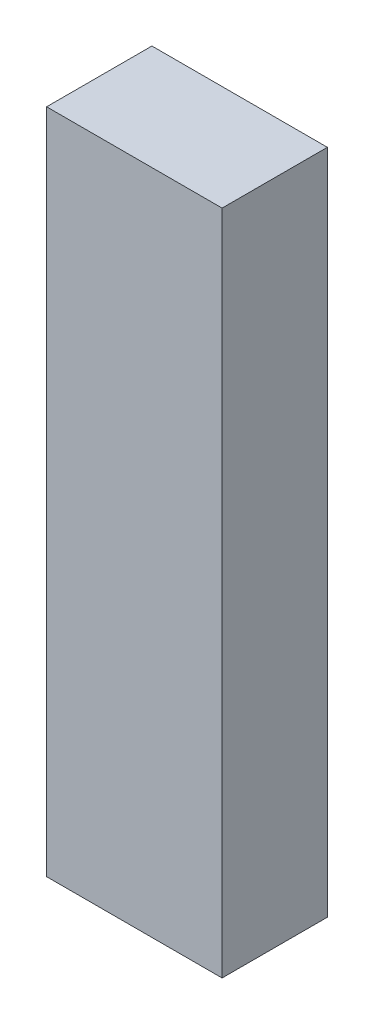
ISO-10303-21;
HEADER;
FILE_DESCRIPTION(('STEP AP214'),'2;1');
FILE_NAME('part.step','',(''),(''),'','','');
FILE_SCHEMA(('AUTOMOTIVE_DESIGN { 1 0 10303 214 1 1 1 1 }'));
ENDSEC;
DATA;
#1=APPLICATION_CONTEXT('core data for automotive mechanical design processes');
#2=APPLICATION_PROTOCOL_DEFINITION('international standard','automotive_design',2000,#1);
#3=PRODUCT_CONTEXT('',#1,'mechanical');
#4=PRODUCT('Part','Part','',(#3));
#5=PRODUCT_RELATED_PRODUCT_CATEGORY('part','',(#4));
#6=PRODUCT_DEFINITION_FORMATION('','',#4);
#7=PRODUCT_DEFINITION_CONTEXT('part definition',#1,'design');
#8=PRODUCT_DEFINITION('design','',#6,#7);
#9=PRODUCT_DEFINITION_SHAPE('','',#8);
#10=(LENGTH_UNIT() NAMED_UNIT(*) SI_UNIT(.MILLI.,.METRE.));
#11=(NAMED_UNIT(*) PLANE_ANGLE_UNIT() SI_UNIT($,.RADIAN.));
#12=(NAMED_UNIT(*) SI_UNIT($,.STERADIAN.) SOLID_ANGLE_UNIT());
#13=UNCERTAINTY_MEASURE_WITH_UNIT(LENGTH_MEASURE(1.E-05),#10,'distance_accuracy_value','');
#14=(GEOMETRIC_REPRESENTATION_CONTEXT(3) GLOBAL_UNCERTAINTY_ASSIGNED_CONTEXT((#13)) GLOBAL_UNIT_ASSIGNED_CONTEXT((#10,
#11,#12)) REPRESENTATION_CONTEXT('',''));
#15=CARTESIAN_POINT('',(0.,0.,0.));
#16=DIRECTION('',(0.,0.,1.));
#17=DIRECTION('',(1.,0.,0.));
#18=AXIS2_PLACEMENT_3D('',#15,#16,#17);
#19=CARTESIAN_POINT('',(-0.00280091536228322,17.9559708055331,-0.699998963258989));
#20=DIRECTION('',(0.,-8.74227339409095E-08,1.));
#21=DIRECTION('',(-1.19248806384999E-08,-1.,-8.74227339409095E-08));
#22=AXIS2_PLACEMENT_3D('',#19,#20,#21);
#23=PLANE('',#22);
#24=DIRECTION('',(1.,-1.19248806384999E-08,0.));
#25=VECTOR('',#24,1.);
#26=CARTESIAN_POINT('',(-0.502800938019549,16.0559708114956,-0.699999129362183));
#27=LINE('',#26,#25);
#28=CARTESIAN_POINT('',(-0.502800938019549,16.0559708114956,-0.699999129362183));
#29=VERTEX_POINT('',#28);
#30=CARTESIAN_POINT('',(0.497199061980452,16.0559707995707,-0.699999129362184));
#31=VERTEX_POINT('',#30);
#32=EDGE_CURVE('E27',#29,#31,#27,.T.);
#33=ORIENTED_EDGE('',*,*,#32,.F.);
#34=DIRECTION('',(-1.19248806384999E-08,-1.,-8.74227339409095E-08));
#35=VECTOR('',#34,1.);
#36=CARTESIAN_POINT('',(-0.502800892705019,19.8559708114956,-0.699998797155794));
#37=LINE('',#36,#35);
#38=CARTESIAN_POINT('',(-0.502800892705019,19.8559708114956,-0.699998797155794));
#39=VERTEX_POINT('',#38);
#40=EDGE_CURVE('E81',#39,#29,#37,.T.);
#41=ORIENTED_EDGE('',*,*,#40,.F.);
#42=DIRECTION('',(-1.,1.19248806384999E-08,0.));
#43=VECTOR('',#42,1.);
#44=CARTESIAN_POINT('',(0.497199107294982,19.8559707995706,-0.699998797155795));
#45=LINE('',#44,#43);
#46=CARTESIAN_POINT('',(0.497199107294982,19.8559707995706,-0.699998797155795));
#47=VERTEX_POINT('',#46);
#48=EDGE_CURVE('E66',#47,#39,#45,.T.);
#49=ORIENTED_EDGE('',*,*,#48,.F.);
#50=DIRECTION('',(1.19248806384999E-08,1.,8.74227339409095E-08));
#51=VECTOR('',#50,1.);
#52=CARTESIAN_POINT('',(0.497199061980452,16.0559707995707,-0.699999129362184));
#53=LINE('',#52,#51);
#54=EDGE_CURVE('E106',#31,#47,#53,.T.);
#55=ORIENTED_EDGE('',*,*,#54,.F.);
#56=EDGE_LOOP('',(#33,#41,#49,#55));
#57=FACE_BOUND('',#56,.T.);
#58=ADVANCED_FACE('F17',(#57),#23,.F.);
#59=CARTESIAN_POINT('',(-0.00280091536228322,17.9559707530795,-0.0999989632589908));
#60=DIRECTION('',(0.,-8.74227339409095E-08,1.));
#61=DIRECTION('',(-1.19248806384999E-08,-1.,-8.74227339409095E-08));
#62=AXIS2_PLACEMENT_3D('',#59,#60,#61);
#63=PLANE('',#62);
#64=DIRECTION('',(1.19248806384999E-08,1.,8.74227339409095E-08));
#65=VECTOR('',#64,1.);
#66=CARTESIAN_POINT('',(0.497199061980452,16.0559707471171,-0.0999991293621858));
#67=LINE('',#66,#65);
#68=CARTESIAN_POINT('',(0.497199061980452,16.0559707471171,-0.0999991293621858));
#69=VERTEX_POINT('',#68);
#70=CARTESIAN_POINT('',(0.497199107294982,19.855970747117,-0.0999987971557967));
#71=VERTEX_POINT('',#70);
#72=EDGE_CURVE('E97',#69,#71,#67,.T.);
#73=ORIENTED_EDGE('',*,*,#72,.T.);
#74=DIRECTION('',(-1.,1.19248806384999E-08,0.));
#75=VECTOR('',#74,1.);
#76=CARTESIAN_POINT('',(0.497199107294982,19.855970747117,-0.0999987971557967));
#77=LINE('',#76,#75);
#78=CARTESIAN_POINT('',(-0.502800892705019,19.8559707590419,-0.0999987971557958));
#79=VERTEX_POINT('',#78);
#80=EDGE_CURVE('E84',#71,#79,#77,.T.);
#81=ORIENTED_EDGE('',*,*,#80,.T.);
#82=DIRECTION('',(-1.19248806384999E-08,-1.,-8.74227339409095E-08));
#83=VECTOR('',#82,1.);
#84=CARTESIAN_POINT('',(-0.502800892705019,19.8559707590419,-0.0999987971557958));
#85=LINE('',#84,#83);
#86=CARTESIAN_POINT('',(-0.502800938019549,16.0559707590419,-0.0999991293621849));
#87=VERTEX_POINT('',#86);
#88=EDGE_CURVE('E77',#79,#87,#85,.T.);
#89=ORIENTED_EDGE('',*,*,#88,.T.);
#90=DIRECTION('',(1.,-1.19248806384999E-08,0.));
#91=VECTOR('',#90,1.);
#92=CARTESIAN_POINT('',(-0.502800938019549,16.0559707590419,-0.0999991293621849));
#93=LINE('',#92,#91);
#94=EDGE_CURVE('E11',#87,#69,#93,.T.);
#95=ORIENTED_EDGE('',*,*,#94,.T.);
#96=EDGE_LOOP('',(#73,#81,#89,#95));
#97=FACE_BOUND('',#96,.T.);
#98=ADVANCED_FACE('F155',(#97),#63,.T.);
#99=CARTESIAN_POINT('',(-0.502800938019549,16.0559707590419,-0.0999991293621849));
#100=DIRECTION('',(-1.19248806384999E-08,-1.,-8.74227339409095E-08));
#101=DIRECTION('',(1.,-1.19248806384999E-08,0.));
#102=AXIS2_PLACEMENT_3D('',#99,#100,#101);
#103=PLANE('',#102);
#104=DIRECTION('',(0.,8.74227339409095E-08,-1.));
#105=VECTOR('',#104,1.);
#106=CARTESIAN_POINT('',(-0.502800938019549,16.0559707590419,-0.0999991293621849));
#107=LINE('',#106,#105);
#108=EDGE_CURVE('E83',#87,#29,#107,.T.);
#109=ORIENTED_EDGE('',*,*,#108,.T.);
#110=ORIENTED_EDGE('',*,*,#32,.T.);
#111=DIRECTION('',(0.,8.74227339409095E-08,-1.));
#112=VECTOR('',#111,1.);
#113=CARTESIAN_POINT('',(0.497199061980452,16.0559707471171,-0.0999991293621858));
#114=LINE('',#113,#112);
#115=EDGE_CURVE('E108',#69,#31,#114,.T.);
#116=ORIENTED_EDGE('',*,*,#115,.F.);
#117=ORIENTED_EDGE('',*,*,#94,.F.);
#118=EDGE_LOOP('',(#109,#110,#116,#117));
#119=FACE_BOUND('',#118,.T.);
#120=ADVANCED_FACE('F153',(#119),#103,.T.);
#121=CARTESIAN_POINT('',(-0.502800892705019,19.8559707590419,-0.0999987971557958));
#122=DIRECTION('',(-1.,1.19248806384999E-08,0.));
#123=DIRECTION('',(-1.19248806384999E-08,-1.,-8.74227339409095E-08));
#124=AXIS2_PLACEMENT_3D('',#121,#122,#123);
#125=PLANE('',#124);
#126=DIRECTION('',(0.,8.74227339409095E-08,-1.));
#127=VECTOR('',#126,1.);
#128=CARTESIAN_POINT('',(-0.502800892705019,19.8559707590419,-0.0999987971557958));
#129=LINE('',#128,#127);
#130=EDGE_CURVE('E87',#79,#39,#129,.T.);
#131=ORIENTED_EDGE('',*,*,#130,.T.);
#132=ORIENTED_EDGE('',*,*,#40,.T.);
#133=ORIENTED_EDGE('',*,*,#108,.F.);
#134=ORIENTED_EDGE('',*,*,#88,.F.);
#135=EDGE_LOOP('',(#131,#132,#133,#134));
#136=FACE_BOUND('',#135,.T.);
#137=ADVANCED_FACE('F88',(#136),#125,.T.);
#138=CARTESIAN_POINT('',(0.497199107294982,19.855970747117,-0.0999987971557967));
#139=DIRECTION('',(1.19248806384999E-08,1.,8.74227339409095E-08));
#140=DIRECTION('',(-1.,1.19248806384999E-08,0.));
#141=AXIS2_PLACEMENT_3D('',#138,#139,#140);
#142=PLANE('',#141);
#143=DIRECTION('',(0.,8.74227339409095E-08,-1.));
#144=VECTOR('',#143,1.);
#145=CARTESIAN_POINT('',(0.497199107294982,19.855970747117,-0.0999987971557967));
#146=LINE('',#145,#144);
#147=EDGE_CURVE('E94',#71,#47,#146,.T.);
#148=ORIENTED_EDGE('',*,*,#147,.T.);
#149=ORIENTED_EDGE('',*,*,#48,.T.);
#150=ORIENTED_EDGE('',*,*,#130,.F.);
#151=ORIENTED_EDGE('',*,*,#80,.F.);
#152=EDGE_LOOP('',(#148,#149,#150,#151));
#153=FACE_BOUND('',#152,.T.);
#154=ADVANCED_FACE('F92',(#153),#142,.T.);
#155=CARTESIAN_POINT('',(0.497199061980452,16.0559707471171,-0.0999991293621858));
#156=DIRECTION('',(1.,-1.19248806384999E-08,0.));
#157=DIRECTION('',(1.19248806384999E-08,1.,8.74227339409095E-08));
#158=AXIS2_PLACEMENT_3D('',#155,#156,#157);
#159=PLANE('',#158);
#160=ORIENTED_EDGE('',*,*,#115,.T.);
#161=ORIENTED_EDGE('',*,*,#54,.T.);
#162=ORIENTED_EDGE('',*,*,#147,.F.);
#163=ORIENTED_EDGE('',*,*,#72,.F.);
#164=EDGE_LOOP('',(#160,#161,#162,#163));
#165=FACE_BOUND('',#164,.T.);
#166=ADVANCED_FACE('F197',(#165),#159,.T.);
#167=CLOSED_SHELL('',(#58,#98,#120,#137,#154,#166));
#168=MANIFOLD_SOLID_BREP('B1',#167);
#169=ADVANCED_BREP_SHAPE_REPRESENTATION('',(#18,#168),#14);
#170=SHAPE_DEFINITION_REPRESENTATION(#9,#169);
ENDSEC;
END-ISO-10303-21;
